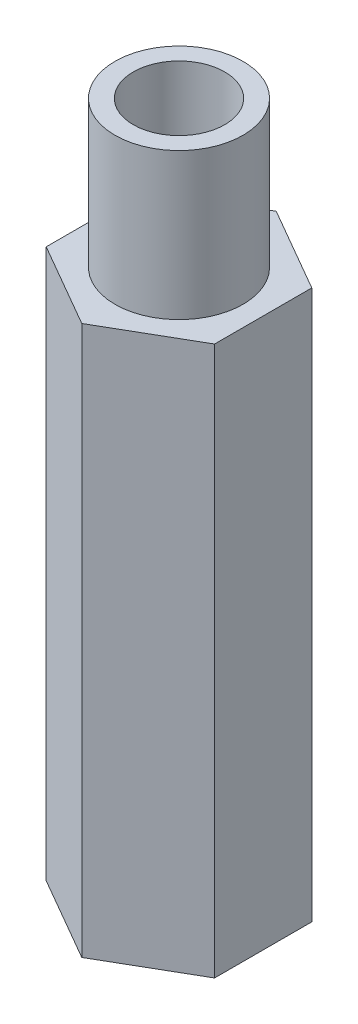
ISO-10303-21;
HEADER;
FILE_DESCRIPTION(('STEP AP214'),'2;1');
FILE_NAME('part.step','',(''),(''),'','','');
FILE_SCHEMA(('AUTOMOTIVE_DESIGN { 1 0 10303 214 1 1 1 1 }'));
ENDSEC;
DATA;
#1=APPLICATION_CONTEXT('core data for automotive mechanical design processes');
#2=APPLICATION_PROTOCOL_DEFINITION('international standard','automotive_design',2000,#1);
#3=PRODUCT_CONTEXT('',#1,'mechanical');
#4=PRODUCT('Part','Part','',(#3));
#5=PRODUCT_RELATED_PRODUCT_CATEGORY('part','',(#4));
#6=PRODUCT_DEFINITION_FORMATION('','',#4);
#7=PRODUCT_DEFINITION_CONTEXT('part definition',#1,'design');
#8=PRODUCT_DEFINITION('design','',#6,#7);
#9=PRODUCT_DEFINITION_SHAPE('','',#8);
#10=(LENGTH_UNIT() NAMED_UNIT(*) SI_UNIT(.MILLI.,.METRE.));
#11=(NAMED_UNIT(*) PLANE_ANGLE_UNIT() SI_UNIT($,.RADIAN.));
#12=(NAMED_UNIT(*) SI_UNIT($,.STERADIAN.) SOLID_ANGLE_UNIT());
#13=UNCERTAINTY_MEASURE_WITH_UNIT(LENGTH_MEASURE(1.E-05),#10,'distance_accuracy_value','');
#14=(GEOMETRIC_REPRESENTATION_CONTEXT(3) GLOBAL_UNCERTAINTY_ASSIGNED_CONTEXT((#13)) GLOBAL_UNIT_ASSIGNED_CONTEXT((#10,
#11,#12)) REPRESENTATION_CONTEXT('',''));
#15=CARTESIAN_POINT('',(0.,0.,0.));
#16=DIRECTION('',(0.,0.,1.));
#17=DIRECTION('',(1.,0.,0.));
#18=AXIS2_PLACEMENT_3D('',#15,#16,#17);
#19=CARTESIAN_POINT('',(2.29999999999999,15.,-1.32790561913617));
#20=DIRECTION('',(-0.499999999999995,0.,0.866025403784441));
#21=DIRECTION('',(0.866025403784442,0.,0.499999999999995));
#22=AXIS2_PLACEMENT_3D('',#19,#20,#21);
#23=PLANE('',#22);
#24=DIRECTION('',(-0.866025403784442,0.,-0.499999999999995));
#25=VECTOR('',#24,1.);
#26=CARTESIAN_POINT('',(2.29999999999999,0.,-1.32790561913617));
#27=LINE('',#26,#25);
#28=CARTESIAN_POINT('',(2.29999999999999,0.,-1.32790561913617));
#29=VERTEX_POINT('',#28);
#30=CARTESIAN_POINT('',(0.,0.,-2.65581123827228));
#31=VERTEX_POINT('',#30);
#32=EDGE_CURVE('E127',#29,#31,#27,.T.);
#33=ORIENTED_EDGE('',*,*,#32,.T.);
#34=DIRECTION('',(0.,-1.,0.));
#35=VECTOR('',#34,1.);
#36=CARTESIAN_POINT('',(0.,15.,-2.65581123827228));
#37=LINE('',#36,#35);
#38=CARTESIAN_POINT('',(0.,15.,-2.65581123827228));
#39=VERTEX_POINT('',#38);
#40=EDGE_CURVE('E44',#39,#31,#37,.T.);
#41=ORIENTED_EDGE('',*,*,#40,.F.);
#42=DIRECTION('',(-0.866025403784442,0.,-0.499999999999995));
#43=VECTOR('',#42,1.);
#44=CARTESIAN_POINT('',(2.29999999999999,15.,-1.32790561913617));
#45=LINE('',#44,#43);
#46=CARTESIAN_POINT('',(2.29999999999999,15.,-1.32790561913617));
#47=VERTEX_POINT('',#46);
#48=EDGE_CURVE('E138',#47,#39,#45,.T.);
#49=ORIENTED_EDGE('',*,*,#48,.F.);
#50=DIRECTION('',(0.,-1.,0.));
#51=VECTOR('',#50,1.);
#52=CARTESIAN_POINT('',(2.29999999999999,15.,-1.32790561913617));
#53=LINE('',#52,#51);
#54=EDGE_CURVE('E123',#47,#29,#53,.T.);
#55=ORIENTED_EDGE('',*,*,#54,.T.);
#56=EDGE_LOOP('',(#33,#41,#49,#55));
#57=FACE_BOUND('',#56,.T.);
#58=ADVANCED_FACE('F41',(#57),#23,.F.);
#59=CARTESIAN_POINT('',(0.,15.,-2.65581123827228));
#60=DIRECTION('',(0.500000000000001,0.,0.866025403784438));
#61=DIRECTION('',(0.866025403784438,0.,-0.500000000000001));
#62=AXIS2_PLACEMENT_3D('',#59,#60,#61);
#63=PLANE('',#62);
#64=DIRECTION('',(-0.866025403784438,0.,0.500000000000001));
#65=VECTOR('',#64,1.);
#66=CARTESIAN_POINT('',(0.,0.,-2.65581123827228));
#67=LINE('',#66,#65);
#68=CARTESIAN_POINT('',(-2.3,0.,-1.32790561913613));
#69=VERTEX_POINT('',#68);
#70=EDGE_CURVE('E130',#31,#69,#67,.T.);
#71=ORIENTED_EDGE('',*,*,#70,.T.);
#72=DIRECTION('',(0.,-1.,0.));
#73=VECTOR('',#72,1.);
#74=CARTESIAN_POINT('',(-2.3,15.,-1.32790561913613));
#75=LINE('',#74,#73);
#76=CARTESIAN_POINT('',(-2.3,15.,-1.32790561913613));
#77=VERTEX_POINT('',#76);
#78=EDGE_CURVE('E141',#77,#69,#75,.T.);
#79=ORIENTED_EDGE('',*,*,#78,.F.);
#80=DIRECTION('',(-0.866025403784438,0.,0.500000000000001));
#81=VECTOR('',#80,1.);
#82=CARTESIAN_POINT('',(0.,15.,-2.65581123827228));
#83=LINE('',#82,#81);
#84=EDGE_CURVE('E96',#39,#77,#83,.T.);
#85=ORIENTED_EDGE('',*,*,#84,.F.);
#86=ORIENTED_EDGE('',*,*,#40,.T.);
#87=EDGE_LOOP('',(#71,#79,#85,#86));
#88=FACE_BOUND('',#87,.T.);
#89=ADVANCED_FACE('F146',(#88),#63,.F.);
#90=CARTESIAN_POINT('',(-2.3,15.,-1.32790561913613));
#91=DIRECTION('',(1.,0.,0.));
#92=DIRECTION('',(0.,0.,-1.));
#93=AXIS2_PLACEMENT_3D('',#90,#91,#92);
#94=PLANE('',#93);
#95=DIRECTION('',(0.,0.,1.));
#96=VECTOR('',#95,1.);
#97=CARTESIAN_POINT('',(-2.3,0.,-1.32790561913613));
#98=LINE('',#97,#96);
#99=CARTESIAN_POINT('',(-2.3,0.,1.32790561913615));
#100=VERTEX_POINT('',#99);
#101=EDGE_CURVE('E133',#69,#100,#98,.T.);
#102=ORIENTED_EDGE('',*,*,#101,.T.);
#103=DIRECTION('',(0.,-1.,0.));
#104=VECTOR('',#103,1.);
#105=CARTESIAN_POINT('',(-2.3,15.,1.32790561913615));
#106=LINE('',#105,#104);
#107=CARTESIAN_POINT('',(-2.3,15.,1.32790561913615));
#108=VERTEX_POINT('',#107);
#109=EDGE_CURVE('E118',#108,#100,#106,.T.);
#110=ORIENTED_EDGE('',*,*,#109,.F.);
#111=DIRECTION('',(0.,0.,1.));
#112=VECTOR('',#111,1.);
#113=CARTESIAN_POINT('',(-2.3,15.,-1.32790561913613));
#114=LINE('',#113,#112);
#115=EDGE_CURVE('E109',#77,#108,#114,.T.);
#116=ORIENTED_EDGE('',*,*,#115,.F.);
#117=ORIENTED_EDGE('',*,*,#78,.T.);
#118=EDGE_LOOP('',(#102,#110,#116,#117));
#119=FACE_BOUND('',#118,.T.);
#120=ADVANCED_FACE('F152',(#119),#94,.F.);
#121=CARTESIAN_POINT('',(-2.3,15.,1.32790561913615));
#122=DIRECTION('',(0.499999999999995,0.,-0.866025403784442));
#123=DIRECTION('',(-0.866025403784442,0.,-0.499999999999995));
#124=AXIS2_PLACEMENT_3D('',#121,#122,#123);
#125=PLANE('',#124);
#126=DIRECTION('',(0.866025403784442,0.,0.499999999999995));
#127=VECTOR('',#126,1.);
#128=CARTESIAN_POINT('',(-2.3,0.,1.32790561913615));
#129=LINE('',#128,#127);
#130=CARTESIAN_POINT('',(0.,0.,2.65581123827228));
#131=VERTEX_POINT('',#130);
#132=EDGE_CURVE('E117',#100,#131,#129,.T.);
#133=ORIENTED_EDGE('',*,*,#132,.T.);
#134=DIRECTION('',(0.,-1.,0.));
#135=VECTOR('',#134,1.);
#136=CARTESIAN_POINT('',(0.,15.,2.65581123827228));
#137=LINE('',#136,#135);
#138=CARTESIAN_POINT('',(0.,15.,2.65581123827228));
#139=VERTEX_POINT('',#138);
#140=EDGE_CURVE('E114',#139,#131,#137,.T.);
#141=ORIENTED_EDGE('',*,*,#140,.F.);
#142=DIRECTION('',(0.866025403784442,0.,0.499999999999995));
#143=VECTOR('',#142,1.);
#144=CARTESIAN_POINT('',(-2.3,15.,1.32790561913615));
#145=LINE('',#144,#143);
#146=EDGE_CURVE('E103',#108,#139,#145,.T.);
#147=ORIENTED_EDGE('',*,*,#146,.F.);
#148=ORIENTED_EDGE('',*,*,#109,.T.);
#149=EDGE_LOOP('',(#133,#141,#147,#148));
#150=FACE_BOUND('',#149,.T.);
#151=ADVANCED_FACE('F115',(#150),#125,.F.);
#152=CARTESIAN_POINT('',(0.,15.,2.65581123827228));
#153=DIRECTION('',(-0.500000000000007,0.,-0.866025403784434));
#154=DIRECTION('',(-0.866025403784435,0.,0.500000000000007));
#155=AXIS2_PLACEMENT_3D('',#152,#153,#154);
#156=PLANE('',#155);
#157=DIRECTION('',(0.866025403784435,0.,-0.500000000000007));
#158=VECTOR('',#157,1.);
#159=CARTESIAN_POINT('',(0.,0.,2.65581123827228));
#160=LINE('',#159,#158);
#161=CARTESIAN_POINT('',(2.30000000000001,0.,1.32790561913612));
#162=VERTEX_POINT('',#161);
#163=EDGE_CURVE('E81',#131,#162,#160,.T.);
#164=ORIENTED_EDGE('',*,*,#163,.T.);
#165=DIRECTION('',(0.,-1.,0.));
#166=VECTOR('',#165,1.);
#167=CARTESIAN_POINT('',(2.30000000000001,15.,1.32790561913612));
#168=LINE('',#167,#166);
#169=CARTESIAN_POINT('',(2.30000000000001,15.,1.32790561913612));
#170=VERTEX_POINT('',#169);
#171=EDGE_CURVE('E119',#170,#162,#168,.T.);
#172=ORIENTED_EDGE('',*,*,#171,.F.);
#173=DIRECTION('',(0.866025403784435,0.,-0.500000000000007));
#174=VECTOR('',#173,1.);
#175=CARTESIAN_POINT('',(0.,15.,2.65581123827228));
#176=LINE('',#175,#174);
#177=EDGE_CURVE('E107',#139,#170,#176,.T.);
#178=ORIENTED_EDGE('',*,*,#177,.F.);
#179=ORIENTED_EDGE('',*,*,#140,.T.);
#180=EDGE_LOOP('',(#164,#172,#178,#179));
#181=FACE_BOUND('',#180,.T.);
#182=ADVANCED_FACE('F121',(#181),#156,.F.);
#183=CARTESIAN_POINT('',(2.30000000000001,15.,1.32790561913612));
#184=DIRECTION('',(-1.,0.,0.));
#185=DIRECTION('',(0.,0.,1.));
#186=AXIS2_PLACEMENT_3D('',#183,#184,#185);
#187=PLANE('',#186);
#188=DIRECTION('',(0.,0.,-1.));
#189=VECTOR('',#188,1.);
#190=CARTESIAN_POINT('',(2.30000000000001,0.,1.32790561913612));
#191=LINE('',#190,#189);
#192=EDGE_CURVE('E87',#162,#29,#191,.T.);
#193=ORIENTED_EDGE('',*,*,#192,.T.);
#194=ORIENTED_EDGE('',*,*,#54,.F.);
#195=DIRECTION('',(0.,0.,-1.));
#196=VECTOR('',#195,1.);
#197=CARTESIAN_POINT('',(2.30000000000001,15.,1.32790561913612));
#198=LINE('',#197,#196);
#199=EDGE_CURVE('E58',#170,#47,#198,.T.);
#200=ORIENTED_EDGE('',*,*,#199,.F.);
#201=ORIENTED_EDGE('',*,*,#171,.T.);
#202=EDGE_LOOP('',(#193,#194,#200,#201));
#203=FACE_BOUND('',#202,.T.);
#204=ADVANCED_FACE('F180',(#203),#187,.F.);
#205=CARTESIAN_POINT('',(0.,15.,0.));
#206=DIRECTION('',(0.,1.,0.));
#207=DIRECTION('',(0.,0.,1.));
#208=AXIS2_PLACEMENT_3D('',#205,#206,#207);
#209=PLANE('',#208);
#210=CARTESIAN_POINT('',(0.,15.,0.));
#211=DIRECTION('',(0.,1.,0.));
#212=DIRECTION('',(0.,0.,1.));
#213=AXIS2_PLACEMENT_3D('',#210,#211,#212);
#214=CIRCLE('',#213,1.75);
#215=CARTESIAN_POINT('',(0.,15.,1.75));
#216=VERTEX_POINT('',#215);
#217=EDGE_CURVE('E11',#216,#216,#214,.T.);
#218=ORIENTED_EDGE('',*,*,#217,.F.);
#219=EDGE_LOOP('',(#218));
#220=FACE_BOUND('',#219,.T.);
#221=ORIENTED_EDGE('',*,*,#48,.T.);
#222=ORIENTED_EDGE('',*,*,#84,.T.);
#223=ORIENTED_EDGE('',*,*,#115,.T.);
#224=ORIENTED_EDGE('',*,*,#146,.T.);
#225=ORIENTED_EDGE('',*,*,#177,.T.);
#226=ORIENTED_EDGE('',*,*,#199,.T.);
#227=EDGE_LOOP('',(#221,#222,#223,#224,#225,#226));
#228=FACE_BOUND('',#227,.T.);
#229=ADVANCED_FACE('F105',(#220,#228),#209,.T.);
#230=CARTESIAN_POINT('',(0.,0.,0.));
#231=DIRECTION('',(0.,1.,0.));
#232=DIRECTION('',(0.,0.,1.));
#233=AXIS2_PLACEMENT_3D('',#230,#231,#232);
#234=PLANE('',#233);
#235=CARTESIAN_POINT('',(0.,0.,0.));
#236=DIRECTION('',(0.,1.,0.));
#237=DIRECTION('',(0.,0.,1.));
#238=AXIS2_PLACEMENT_3D('',#235,#236,#237);
#239=CIRCLE('',#238,1.25);
#240=CARTESIAN_POINT('',(0.,0.,1.25));
#241=VERTEX_POINT('',#240);
#242=EDGE_CURVE('E158',#241,#241,#239,.T.);
#243=ORIENTED_EDGE('',*,*,#242,.T.);
#244=EDGE_LOOP('',(#243));
#245=FACE_BOUND('',#244,.T.);
#246=ORIENTED_EDGE('',*,*,#32,.F.);
#247=ORIENTED_EDGE('',*,*,#192,.F.);
#248=ORIENTED_EDGE('',*,*,#163,.F.);
#249=ORIENTED_EDGE('',*,*,#132,.F.);
#250=ORIENTED_EDGE('',*,*,#101,.F.);
#251=ORIENTED_EDGE('',*,*,#70,.F.);
#252=EDGE_LOOP('',(#246,#247,#248,#249,#250,#251));
#253=FACE_BOUND('',#252,.T.);
#254=ADVANCED_FACE('F151',(#245,#253),#234,.F.);
#255=CARTESIAN_POINT('',(0.,19.,0.));
#256=DIRECTION('',(0.,-1.,0.));
#257=DIRECTION('',(0.,0.,-1.));
#258=AXIS2_PLACEMENT_3D('',#255,#256,#257);
#259=CYLINDRICAL_SURFACE('',#258,1.75);
#260=CARTESIAN_POINT('',(0.,19.,0.));
#261=DIRECTION('',(0.,1.,0.));
#262=DIRECTION('',(0.,0.,1.));
#263=AXIS2_PLACEMENT_3D('',#260,#261,#262);
#264=CIRCLE('',#263,1.75);
#265=CARTESIAN_POINT('',(0.,19.,1.75));
#266=VERTEX_POINT('',#265);
#267=EDGE_CURVE('E131',#266,#266,#264,.T.);
#268=ORIENTED_EDGE('',*,*,#267,.F.);
#269=EDGE_LOOP('',(#268));
#270=FACE_BOUND('',#269,.T.);
#271=ORIENTED_EDGE('',*,*,#217,.T.);
#272=EDGE_LOOP('',(#271));
#273=FACE_BOUND('',#272,.T.);
#274=ADVANCED_FACE('F170',(#270,#273),#259,.T.);
#275=CARTESIAN_POINT('',(0.,19.,0.));
#276=DIRECTION('',(0.,1.,0.));
#277=DIRECTION('',(0.,0.,1.));
#278=AXIS2_PLACEMENT_3D('',#275,#276,#277);
#279=PLANE('',#278);
#280=CARTESIAN_POINT('',(0.,19.,0.));
#281=DIRECTION('',(0.,1.,0.));
#282=DIRECTION('',(0.,0.,1.));
#283=AXIS2_PLACEMENT_3D('',#280,#281,#282);
#284=CIRCLE('',#283,1.25);
#285=CARTESIAN_POINT('',(0.,19.,1.25));
#286=VERTEX_POINT('',#285);
#287=EDGE_CURVE('E161',#286,#286,#284,.T.);
#288=ORIENTED_EDGE('',*,*,#287,.F.);
#289=EDGE_LOOP('',(#288));
#290=FACE_BOUND('',#289,.T.);
#291=ORIENTED_EDGE('',*,*,#267,.T.);
#292=EDGE_LOOP('',(#291));
#293=FACE_BOUND('',#292,.T.);
#294=ADVANCED_FACE('F167',(#290,#293),#279,.T.);
#295=CARTESIAN_POINT('',(0.,19.,0.));
#296=DIRECTION('',(0.,1.,0.));
#297=DIRECTION('',(0.,0.,1.));
#298=AXIS2_PLACEMENT_3D('',#295,#296,#297);
#299=CYLINDRICAL_SURFACE('',#298,1.25);
#300=ORIENTED_EDGE('',*,*,#242,.F.);
#301=EDGE_LOOP('',(#300));
#302=FACE_BOUND('',#301,.T.);
#303=ORIENTED_EDGE('',*,*,#287,.T.);
#304=EDGE_LOOP('',(#303));
#305=FACE_BOUND('',#304,.T.);
#306=ADVANCED_FACE('F165',(#302,#305),#299,.F.);
#307=CLOSED_SHELL('',(#58,#89,#120,#151,#182,#204,#229,#254,#274,#294,#306));
#308=MANIFOLD_SOLID_BREP('B2',#307);
#309=ADVANCED_BREP_SHAPE_REPRESENTATION('',(#18,#308),#14);
#310=SHAPE_DEFINITION_REPRESENTATION(#9,#309);
ENDSEC;
END-ISO-10303-21;
